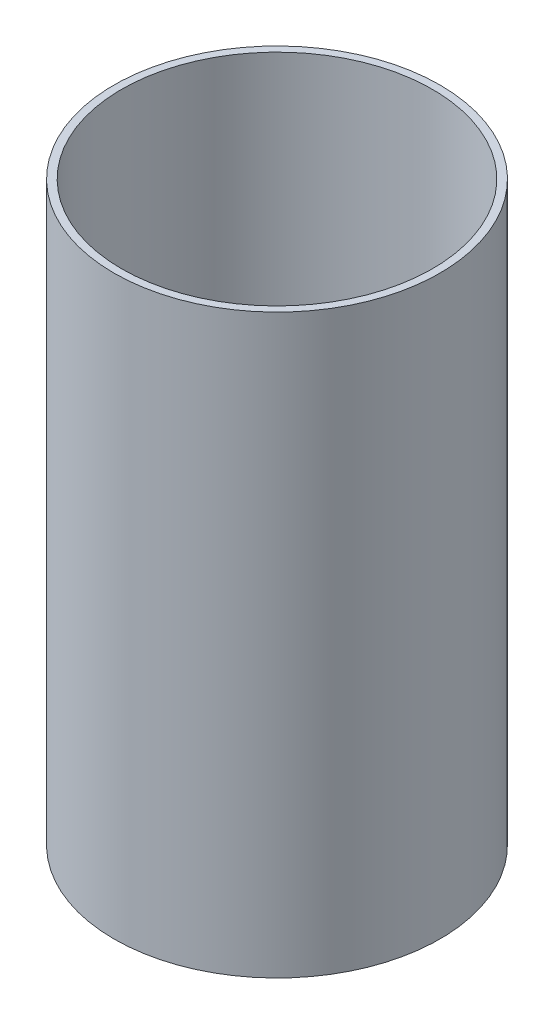
ISO-10303-21;
HEADER;
FILE_DESCRIPTION(('STEP AP214'),'2;1');
FILE_NAME('part.step','',(''),(''),'','','');
FILE_SCHEMA(('AUTOMOTIVE_DESIGN { 1 0 10303 214 1 1 1 1 }'));
ENDSEC;
DATA;
#1=APPLICATION_CONTEXT('core data for automotive mechanical design processes');
#2=APPLICATION_PROTOCOL_DEFINITION('international standard','automotive_design',2000,#1);
#3=PRODUCT_CONTEXT('',#1,'mechanical');
#4=PRODUCT('Part','Part','',(#3));
#5=PRODUCT_RELATED_PRODUCT_CATEGORY('part','',(#4));
#6=PRODUCT_DEFINITION_FORMATION('','',#4);
#7=PRODUCT_DEFINITION_CONTEXT('part definition',#1,'design');
#8=PRODUCT_DEFINITION('design','',#6,#7);
#9=PRODUCT_DEFINITION_SHAPE('','',#8);
#10=(LENGTH_UNIT() NAMED_UNIT(*) SI_UNIT(.MILLI.,.METRE.));
#11=(NAMED_UNIT(*) PLANE_ANGLE_UNIT() SI_UNIT($,.RADIAN.));
#12=(NAMED_UNIT(*) SI_UNIT($,.STERADIAN.) SOLID_ANGLE_UNIT());
#13=UNCERTAINTY_MEASURE_WITH_UNIT(LENGTH_MEASURE(1.E-05),#10,'distance_accuracy_value','');
#14=(GEOMETRIC_REPRESENTATION_CONTEXT(3) GLOBAL_UNCERTAINTY_ASSIGNED_CONTEXT((#13)) GLOBAL_UNIT_ASSIGNED_CONTEXT((#10,
#11,#12)) REPRESENTATION_CONTEXT('',''));
#15=CARTESIAN_POINT('',(0.,0.,0.));
#16=DIRECTION('',(0.,0.,1.));
#17=DIRECTION('',(1.,0.,0.));
#18=AXIS2_PLACEMENT_3D('',#15,#16,#17);
#19=CARTESIAN_POINT('',(0.,115.,0.));
#20=DIRECTION('',(0.,1.,0.));
#21=DIRECTION('',(0.,0.,1.));
#22=AXIS2_PLACEMENT_3D('',#19,#20,#21);
#23=PLANE('',#22);
#24=CARTESIAN_POINT('',(0.,115.,0.));
#25=DIRECTION('',(0.,1.,0.));
#26=DIRECTION('',(0.,0.,1.));
#27=AXIS2_PLACEMENT_3D('',#24,#25,#26);
#28=CIRCLE('',#27,32.5);
#29=CARTESIAN_POINT('',(0.,115.,32.5));
#30=VERTEX_POINT('',#29);
#31=EDGE_CURVE('E10',#30,#30,#28,.T.);
#32=ORIENTED_EDGE('',*,*,#31,.T.);
#33=EDGE_LOOP('',(#32));
#34=FACE_BOUND('',#33,.T.);
#35=CARTESIAN_POINT('',(0.,115.,0.));
#36=DIRECTION('',(0.,1.,0.));
#37=DIRECTION('',(0.,0.,1.));
#38=AXIS2_PLACEMENT_3D('',#35,#36,#37);
#39=CIRCLE('',#38,31.);
#40=CARTESIAN_POINT('',(0.,115.,31.));
#41=VERTEX_POINT('',#40);
#42=EDGE_CURVE('E41',#41,#41,#39,.T.);
#43=ORIENTED_EDGE('',*,*,#42,.F.);
#44=EDGE_LOOP('',(#43));
#45=FACE_BOUND('',#44,.T.);
#46=ADVANCED_FACE('F30',(#34,#45),#23,.T.);
#47=CARTESIAN_POINT('',(0.,0.,0.));
#48=DIRECTION('',(0.,1.,0.));
#49=DIRECTION('',(0.,0.,1.));
#50=AXIS2_PLACEMENT_3D('',#47,#48,#49);
#51=PLANE('',#50);
#52=CARTESIAN_POINT('',(0.,0.,0.));
#53=DIRECTION('',(0.,1.,0.));
#54=DIRECTION('',(0.,0.,1.));
#55=AXIS2_PLACEMENT_3D('',#52,#53,#54);
#56=CIRCLE('',#55,32.5);
#57=CARTESIAN_POINT('',(0.,0.,32.5));
#58=VERTEX_POINT('',#57);
#59=EDGE_CURVE('E34',#58,#58,#56,.T.);
#60=ORIENTED_EDGE('',*,*,#59,.F.);
#61=EDGE_LOOP('',(#60));
#62=FACE_BOUND('',#61,.T.);
#63=CARTESIAN_POINT('',(0.,0.,0.));
#64=DIRECTION('',(0.,1.,0.));
#65=DIRECTION('',(0.,0.,1.));
#66=AXIS2_PLACEMENT_3D('',#63,#64,#65);
#67=CIRCLE('',#66,31.);
#68=CARTESIAN_POINT('',(0.,0.,31.));
#69=VERTEX_POINT('',#68);
#70=EDGE_CURVE('E43',#69,#69,#67,.T.);
#71=ORIENTED_EDGE('',*,*,#70,.T.);
#72=EDGE_LOOP('',(#71));
#73=FACE_BOUND('',#72,.T.);
#74=ADVANCED_FACE('F53',(#62,#73),#51,.F.);
#75=CARTESIAN_POINT('',(0.,115.,0.));
#76=DIRECTION('',(0.,-1.,0.));
#77=DIRECTION('',(0.,0.,-1.));
#78=AXIS2_PLACEMENT_3D('',#75,#76,#77);
#79=CYLINDRICAL_SURFACE('',#78,32.5);
#80=ORIENTED_EDGE('',*,*,#31,.F.);
#81=EDGE_LOOP('',(#80));
#82=FACE_BOUND('',#81,.T.);
#83=ORIENTED_EDGE('',*,*,#59,.T.);
#84=EDGE_LOOP('',(#83));
#85=FACE_BOUND('',#84,.T.);
#86=ADVANCED_FACE('F32',(#82,#85),#79,.T.);
#87=CARTESIAN_POINT('',(0.,115.,0.));
#88=DIRECTION('',(0.,-1.,0.));
#89=DIRECTION('',(0.,0.,-1.));
#90=AXIS2_PLACEMENT_3D('',#87,#88,#89);
#91=CYLINDRICAL_SURFACE('',#90,31.);
#92=ORIENTED_EDGE('',*,*,#42,.T.);
#93=EDGE_LOOP('',(#92));
#94=FACE_BOUND('',#93,.T.);
#95=ORIENTED_EDGE('',*,*,#70,.F.);
#96=EDGE_LOOP('',(#95));
#97=FACE_BOUND('',#96,.T.);
#98=ADVANCED_FACE('F49',(#94,#97),#91,.F.);
#99=CLOSED_SHELL('',(#46,#74,#86,#98));
#100=MANIFOLD_SOLID_BREP('B2',#99);
#101=ADVANCED_BREP_SHAPE_REPRESENTATION('',(#18,#100),#14);
#102=SHAPE_DEFINITION_REPRESENTATION(#9,#101);
ENDSEC;
END-ISO-10303-21;
